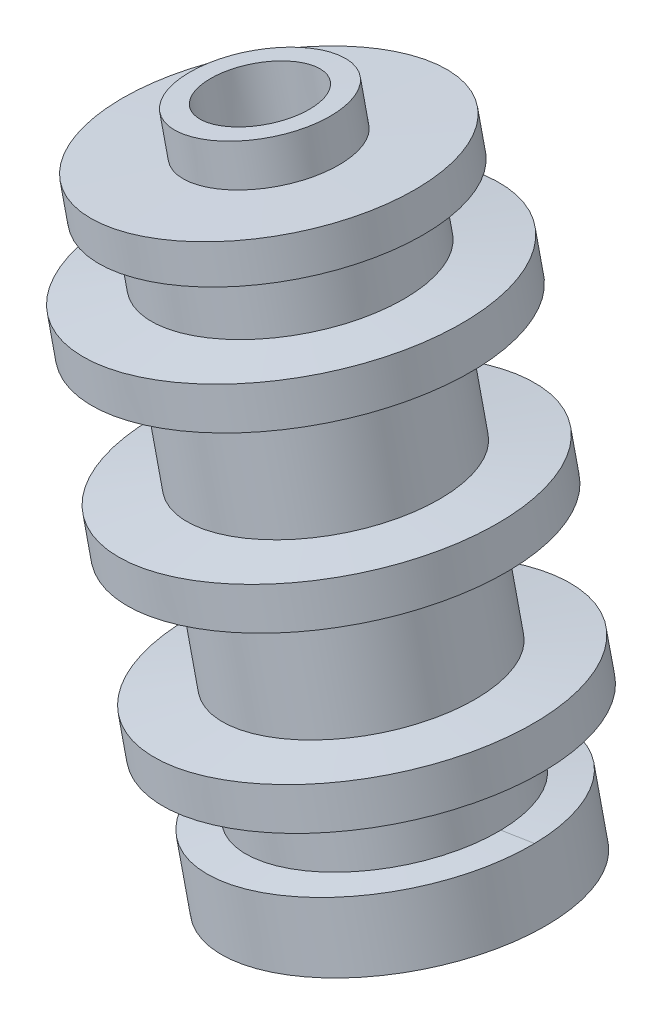
ISO-10303-21;
HEADER;
FILE_DESCRIPTION(('STEP AP214'),'2;1');
FILE_NAME('part.step','',(''),(''),'','','');
FILE_SCHEMA(('AUTOMOTIVE_DESIGN { 1 0 10303 214 1 1 1 1 }'));
ENDSEC;
DATA;
#1=APPLICATION_CONTEXT('core data for automotive mechanical design processes');
#2=APPLICATION_PROTOCOL_DEFINITION('international standard','automotive_design',2000,#1);
#3=PRODUCT_CONTEXT('',#1,'mechanical');
#4=PRODUCT('Part','Part','',(#3));
#5=PRODUCT_RELATED_PRODUCT_CATEGORY('part','',(#4));
#6=PRODUCT_DEFINITION_FORMATION('','',#4);
#7=PRODUCT_DEFINITION_CONTEXT('part definition',#1,'design');
#8=PRODUCT_DEFINITION('design','',#6,#7);
#9=PRODUCT_DEFINITION_SHAPE('','',#8);
#10=(LENGTH_UNIT() NAMED_UNIT(*) SI_UNIT(.MILLI.,.METRE.));
#11=(NAMED_UNIT(*) PLANE_ANGLE_UNIT() SI_UNIT($,.RADIAN.));
#12=(NAMED_UNIT(*) SI_UNIT($,.STERADIAN.) SOLID_ANGLE_UNIT());
#13=UNCERTAINTY_MEASURE_WITH_UNIT(LENGTH_MEASURE(1.E-05),#10,'distance_accuracy_value','');
#14=(GEOMETRIC_REPRESENTATION_CONTEXT(3) GLOBAL_UNCERTAINTY_ASSIGNED_CONTEXT((#13)) GLOBAL_UNIT_ASSIGNED_CONTEXT((#10,
#11,#12)) REPRESENTATION_CONTEXT('',''));
#15=CARTESIAN_POINT('',(0.,0.,0.));
#16=DIRECTION('',(0.,0.,1.));
#17=DIRECTION('',(1.,0.,0.));
#18=AXIS2_PLACEMENT_3D('',#15,#16,#17);
#19=CARTESIAN_POINT('',(-23.4539001258528,-5.09677043690609,0.));
#20=DIRECTION('',(-0.222520933956313,0.974927912181824,0.));
#21=DIRECTION('',(-0.974927912181824,-0.222520933956313,0.));
#22=AXIS2_PLACEMENT_3D('',#19,#20,#21);
#23=CYLINDRICAL_SURFACE('',#22,4.5);
#24=CARTESIAN_POINT('',(-23.2870094253823,-5.82796637105687,0.));
#25=DIRECTION('',(-0.222520933956314,0.974927912181824,0.));
#26=DIRECTION('',(0.974692344569262,0.22246716718597,-0.0219816505823509));
#27=AXIS2_PLACEMENT_3D('',#24,#25,#26);
#28=CIRCLE('',#27,4.50000000003536);
#29=CARTESIAN_POINT('',(-18.9008938747861,-4.82686411871214,-0.0989174276213589));
#30=VERTEX_POINT('',#29);
#31=EDGE_CURVE('E94',#30,#30,#28,.F.);
#32=ORIENTED_EDGE('',*,*,#31,.F.);
#33=EDGE_LOOP('',(#32));
#34=FACE_BOUND('',#33,.T.);
#35=CARTESIAN_POINT('',(-23.5095303593451,-4.85303845884635,0.));
#36=DIRECTION('',(0.222520933956314,-0.974927912181824,0.));
#37=DIRECTION('',(-0.974692344569255,-0.222467167185967,0.0219816505827007));
#38=AXIS2_PLACEMENT_3D('',#35,#36,#37);
#39=CIRCLE('',#38,4.50000000004478);
#40=CARTESIAN_POINT('',(-27.8956459099504,-5.85414071119317,0.0989174276231353));
#41=VERTEX_POINT('',#40);
#42=EDGE_CURVE('E93',#41,#41,#39,.F.);
#43=ORIENTED_EDGE('',*,*,#42,.F.);
#44=EDGE_LOOP('',(#43));
#45=FACE_BOUND('',#44,.T.);
#46=ADVANCED_FACE('F17',(#34,#45),#23,.T.);
#47=CARTESIAN_POINT('',(-23.2870094253812,-5.82796637106157,0.));
#48=DIRECTION('',(-0.222520933956315,0.974927912181824,0.));
#49=DIRECTION('',(-0.974927912181824,-0.222520933956314,0.));
#50=AXIS2_PLACEMENT_3D('',#47,#48,#49);
#51=CONICAL_SURFACE('',#50,4.49999999980098,1.48352986419928);
#52=ORIENTED_EDGE('',*,*,#31,.T.);
#53=EDGE_LOOP('',(#52));
#54=FACE_BOUND('',#53,.T.);
#55=CARTESIAN_POINT('',(-23.257807336708,-5.95590908114882,0.));
#56=DIRECTION('',(-0.222520933956314,0.974927912181824,0.));
#57=DIRECTION('',(-0.974927912181824,-0.222520933956314,0.));
#58=AXIS2_PLACEMENT_3D('',#55,#56,#57);
#59=CIRCLE('',#58,3.);
#60=CARTESIAN_POINT('',(-26.1825910732534,-6.62347188301777,0.));
#61=VERTEX_POINT('',#60);
#62=EDGE_CURVE('E88',#61,#61,#59,.F.);
#63=ORIENTED_EDGE('',*,*,#62,.F.);
#64=EDGE_LOOP('',(#63));
#65=FACE_BOUND('',#64,.T.);
#66=ADVANCED_FACE('F368',(#54,#65),#51,.T.);
#67=CARTESIAN_POINT('',(-23.5095303593462,-4.85303845884165,0.));
#68=DIRECTION('',(0.222520933956314,-0.974927912181824,0.));
#69=DIRECTION('',(0.974927912181824,0.222520933956314,0.));
#70=AXIS2_PLACEMENT_3D('',#67,#68,#69);
#71=CONICAL_SURFACE('',#70,4.4999999998104,1.48352986420687);
#72=CARTESIAN_POINT('',(-23.5387324480194,-4.72509574875428,0.));
#73=DIRECTION('',(-0.222520933956313,0.974927912181824,0.));
#74=DIRECTION('',(-0.974927912181824,-0.222520933956313,0.));
#75=AXIS2_PLACEMENT_3D('',#72,#73,#74);
#76=CIRCLE('',#75,3.);
#77=CARTESIAN_POINT('',(-26.4635161845649,-5.39265855062322,0.));
#78=VERTEX_POINT('',#77);
#79=EDGE_CURVE('E85',#78,#78,#76,.T.);
#80=ORIENTED_EDGE('',*,*,#79,.F.);
#81=EDGE_LOOP('',(#80));
#82=FACE_BOUND('',#81,.T.);
#83=ORIENTED_EDGE('',*,*,#42,.T.);
#84=EDGE_LOOP('',(#83));
#85=FACE_BOUND('',#84,.T.);
#86=ADVANCED_FACE('F359',(#82,#85),#71,.T.);
#87=CARTESIAN_POINT('',(-22.4859340631428,-9.33770685489703,0.));
#88=DIRECTION('',(-0.222520933956314,0.974927912181824,0.));
#89=DIRECTION('',(-0.974927912181824,-0.222520933956314,0.));
#90=AXIS2_PLACEMENT_3D('',#87,#88,#89);
#91=CYLINDRICAL_SURFACE('',#90,3.);
#92=ORIENTED_EDGE('',*,*,#62,.T.);
#93=EDGE_LOOP('',(#92));
#94=FACE_BOUND('',#93,.T.);
#95=CARTESIAN_POINT('',(-22.6263966187943,-8.72230018871812,0.));
#96=DIRECTION('',(0.222520933956314,-0.974927912181824,0.));
#97=DIRECTION('',(-0.974692344569238,-0.222467167185964,0.0219816505834769));
#98=AXIS2_PLACEMENT_3D('',#95,#96,#97);
#99=CIRCLE('',#98,2.99999999989704);
#100=CARTESIAN_POINT('',(-25.5504736524017,-9.3897016902531,0.0659449517481647));
#101=VERTEX_POINT('',#100);
#102=EDGE_CURVE('E82',#101,#101,#99,.T.);
#103=ORIENTED_EDGE('',*,*,#102,.F.);
#104=EDGE_LOOP('',(#103));
#105=FACE_BOUND('',#104,.T.);
#106=ADVANCED_FACE('F350',(#94,#105),#91,.T.);
#107=CARTESIAN_POINT('',(-24.3106057215846,-1.34329797500607,0.));
#108=DIRECTION('',(-0.222520933956313,0.974927912181824,0.));
#109=DIRECTION('',(-0.974927912181824,-0.222520933956313,0.));
#110=AXIS2_PLACEMENT_3D('',#107,#108,#109);
#111=CYLINDRICAL_SURFACE('',#110,3.);
#112=ORIENTED_EDGE('',*,*,#79,.T.);
#113=EDGE_LOOP('',(#112));
#114=FACE_BOUND('',#113,.T.);
#115=CARTESIAN_POINT('',(-24.1701431659336,-1.95870464118275,0.));
#116=DIRECTION('',(-0.222520933956314,0.974927912181824,0.));
#117=DIRECTION('',(0.974692344569255,0.222467167185967,-0.0219816505826857));
#118=AXIS2_PLACEMENT_3D('',#115,#116,#117);
#119=CIRCLE('',#118,3.00000000000479);
#120=CARTESIAN_POINT('',(-21.2460661322211,-1.29130313962378,-0.0659449517481647));
#121=VERTEX_POINT('',#120);
#122=EDGE_CURVE('E79',#121,#121,#119,.T.);
#123=ORIENTED_EDGE('',*,*,#122,.F.);
#124=EDGE_LOOP('',(#123));
#125=FACE_BOUND('',#124,.T.);
#126=ADVANCED_FACE('F341',(#114,#125),#111,.T.);
#127=CARTESIAN_POINT('',(-22.5971945301109,-8.85024289885032,0.));
#128=DIRECTION('',(0.222520933956314,-0.974927912181824,0.));
#129=DIRECTION('',(0.974927912181824,0.222520933956314,0.));
#130=AXIS2_PLACEMENT_3D('',#127,#128,#129);
#131=CONICAL_SURFACE('',#130,4.50000000027079,1.48352986418011);
#132=CARTESIAN_POINT('',(-22.597194530121,-8.85024289880612,0.));
#133=DIRECTION('',(-0.222520933956314,0.974927912181824,0.));
#134=DIRECTION('',(-0.974927912181824,-0.222520933956314,0.));
#135=AXIS2_PLACEMENT_3D('',#132,#133,#134);
#136=CIRCLE('',#135,4.5);
#137=CARTESIAN_POINT('',(-26.9843701349392,-9.85158710160953,0.));
#138=VERTEX_POINT('',#137);
#139=EDGE_CURVE('E76',#138,#138,#136,.F.);
#140=ORIENTED_EDGE('',*,*,#139,.F.);
#141=EDGE_LOOP('',(#140));
#142=FACE_BOUND('',#141,.T.);
#143=ORIENTED_EDGE('',*,*,#102,.T.);
#144=EDGE_LOOP('',(#143));
#145=FACE_BOUND('',#144,.T.);
#146=ADVANCED_FACE('F332',(#142,#145),#131,.T.);
#147=CARTESIAN_POINT('',(-24.1993452546054,-1.83076193110165,0.));
#148=DIRECTION('',(-0.222520933956314,0.974927912181824,0.));
#149=DIRECTION('',(-0.974927912181824,-0.222520933956314,0.));
#150=AXIS2_PLACEMENT_3D('',#147,#148,#149);
#151=CONICAL_SURFACE('',#150,4.49999999984169,1.48352986420807);
#152=ORIENTED_EDGE('',*,*,#122,.T.);
#153=EDGE_LOOP('',(#152));
#154=FACE_BOUND('',#153,.T.);
#155=CARTESIAN_POINT('',(-24.1993452546064,-1.83076193109698,0.));
#156=DIRECTION('',(-0.222520933956313,0.974927912181824,0.));
#157=DIRECTION('',(-0.974927912181824,-0.222520933956313,0.));
#158=AXIS2_PLACEMENT_3D('',#155,#156,#157);
#159=CIRCLE('',#158,4.5);
#160=CARTESIAN_POINT('',(-28.5865208594246,-2.83210613390039,0.));
#161=VERTEX_POINT('',#160);
#162=EDGE_CURVE('E73',#161,#161,#159,.T.);
#163=ORIENTED_EDGE('',*,*,#162,.F.);
#164=EDGE_LOOP('',(#163));
#165=FACE_BOUND('',#164,.T.);
#166=ADVANCED_FACE('F160',(#154,#165),#151,.T.);
#167=CARTESIAN_POINT('',(-22.4859340631428,-9.33770685489703,0.));
#168=DIRECTION('',(-0.222520933956314,0.974927912181824,0.));
#169=DIRECTION('',(-0.974927912181824,-0.222520933956314,0.));
#170=AXIS2_PLACEMENT_3D('',#167,#168,#169);
#171=CYLINDRICAL_SURFACE('',#170,4.5);
#172=ORIENTED_EDGE('',*,*,#139,.T.);
#173=EDGE_LOOP('',(#172));
#174=FACE_BOUND('',#173,.T.);
#175=CARTESIAN_POINT('',(-22.3746735961642,-9.82517081098977,0.));
#176=DIRECTION('',(-0.222520933956314,0.974927912181824,0.));
#177=DIRECTION('',(0.974692344569259,0.222467167185969,-0.0219816505825188));
#178=AXIS2_PLACEMENT_3D('',#175,#176,#177);
#179=CIRCLE('',#178,4.50000000000098);
#180=CARTESIAN_POINT('',(-17.9885580456016,-8.8240685586527,-0.0989174276213589));
#181=VERTEX_POINT('',#180);
#182=EDGE_CURVE('E70',#181,#181,#179,.F.);
#183=ORIENTED_EDGE('',*,*,#182,.F.);
#184=EDGE_LOOP('',(#183));
#185=FACE_BOUND('',#184,.T.);
#186=ADVANCED_FACE('F150',(#174,#185),#171,.T.);
#187=CARTESIAN_POINT('',(-24.3106057215846,-1.34329797500607,0.));
#188=DIRECTION('',(-0.222520933956313,0.974927912181824,0.));
#189=DIRECTION('',(-0.974927912181824,-0.222520933956313,0.));
#190=AXIS2_PLACEMENT_3D('',#187,#188,#189);
#191=CYLINDRICAL_SURFACE('',#190,4.5);
#192=ORIENTED_EDGE('',*,*,#162,.T.);
#193=EDGE_LOOP('',(#192));
#194=FACE_BOUND('',#193,.T.);
#195=CARTESIAN_POINT('',(-24.4218661885603,-0.855834018925778,0.));
#196=DIRECTION('',(0.222520933956314,-0.974927912181824,0.));
#197=DIRECTION('',(-0.974692344569245,-0.222467167185965,0.0219816505831393));
#198=AXIS2_PLACEMENT_3D('',#195,#196,#197);
#199=CIRCLE('',#198,4.499999999955);
#200=CARTESIAN_POINT('',(-28.8079817390781,-1.85693627125261,0.0989174276231353));
#201=VERTEX_POINT('',#200);
#202=EDGE_CURVE('E66',#201,#201,#199,.F.);
#203=ORIENTED_EDGE('',*,*,#202,.F.);
#204=EDGE_LOOP('',(#203));
#205=FACE_BOUND('',#204,.T.);
#206=ADVANCED_FACE('F148',(#194,#205),#191,.T.);
#207=CARTESIAN_POINT('',(-22.3746735961715,-9.82517081095806,0.));
#208=DIRECTION('',(-0.222520933956314,0.974927912181824,0.));
#209=DIRECTION('',(-0.974927912181824,-0.222520933956314,0.));
#210=AXIS2_PLACEMENT_3D('',#207,#208,#209);
#211=CONICAL_SURFACE('',#210,4.50000000024168,1.4835298641941);
#212=ORIENTED_EDGE('',*,*,#182,.T.);
#213=EDGE_LOOP('',(#212));
#214=FACE_BOUND('',#213,.T.);
#215=CARTESIAN_POINT('',(-22.3454715074871,-9.95311352109431,0.));
#216=DIRECTION('',(-0.222520933956314,0.974927912181824,0.));
#217=DIRECTION('',(-0.974927912181824,-0.222520933956314,0.));
#218=AXIS2_PLACEMENT_3D('',#215,#216,#217);
#219=CIRCLE('',#218,3.);
#220=CARTESIAN_POINT('',(-25.2702552440326,-10.6206763229632,0.));
#221=VERTEX_POINT('',#220);
#222=EDGE_CURVE('E69',#221,#221,#219,.F.);
#223=ORIENTED_EDGE('',*,*,#222,.F.);
#224=EDGE_LOOP('',(#223));
#225=FACE_BOUND('',#224,.T.);
#226=ADVANCED_FACE('F144',(#214,#225),#211,.T.);
#227=CARTESIAN_POINT('',(-24.4218661885525,-0.855834018959846,0.));
#228=DIRECTION('',(0.222520933956314,-0.974927912181824,0.));
#229=DIRECTION('',(0.974927912181824,0.222520933956314,0.));
#230=AXIS2_PLACEMENT_3D('',#227,#228,#229);
#231=CONICAL_SURFACE('',#230,4.50000000031287,1.48352986419928);
#232=CARTESIAN_POINT('',(-24.4510682772403,-0.727891308808795,0.));
#233=DIRECTION('',(-0.222520933956313,0.974927912181824,0.));
#234=DIRECTION('',(-0.974927912181824,-0.222520933956313,0.));
#235=AXIS2_PLACEMENT_3D('',#232,#233,#234);
#236=CIRCLE('',#235,3.);
#237=CARTESIAN_POINT('',(-27.3758520137858,-1.39545411067774,0.));
#238=VERTEX_POINT('',#237);
#239=EDGE_CURVE('E52',#238,#238,#236,.T.);
#240=ORIENTED_EDGE('',*,*,#239,.F.);
#241=EDGE_LOOP('',(#240));
#242=FACE_BOUND('',#241,.T.);
#243=ORIENTED_EDGE('',*,*,#202,.T.);
#244=EDGE_LOOP('',(#243));
#245=FACE_BOUND('',#244,.T.);
#246=ADVANCED_FACE('F141',(#242,#245),#231,.T.);
#247=CARTESIAN_POINT('',(-22.4859340631428,-9.33770685489703,0.));
#248=DIRECTION('',(-0.222520933956314,0.974927912181824,0.));
#249=DIRECTION('',(-0.974927912181824,-0.222520933956314,0.));
#250=AXIS2_PLACEMENT_3D('',#247,#248,#249);
#251=CYLINDRICAL_SURFACE('',#250,3.);
#252=ORIENTED_EDGE('',*,*,#222,.T.);
#253=EDGE_LOOP('',(#252));
#254=FACE_BOUND('',#253,.T.);
#255=CARTESIAN_POINT('',(-22.0240619053832,-11.3613009970459,0.));
#256=DIRECTION('',(0.222520933956314,-0.974927912181824,0.));
#257=DIRECTION('',(-0.974692344569272,-0.222467167185972,0.0219816505818862));
#258=AXIS2_PLACEMENT_3D('',#255,#256,#257);
#259=CIRCLE('',#258,3.00000000003333);
#260=CARTESIAN_POINT('',(-24.9481389391165,-12.0287024986044,0.0659449517467177));
#261=VERTEX_POINT('',#260);
#262=CARTESIAN_POINT('',(-19.099984871546,-10.6938994954557,-0.065944951750521));
#263=VERTEX_POINT('',#262);
#264=EDGE_CURVE('E42',#261,#263,#259,.T.);
#265=ORIENTED_EDGE('',*,*,#264,.F.);
#266=CARTESIAN_POINT('',(-22.0240619053832,-11.3613009970459,0.));
#267=DIRECTION('',(0.222520933956314,-0.974927912181824,0.));
#268=DIRECTION('',(-0.974692344569272,-0.222467167185972,0.0219816505818862));
#269=AXIS2_PLACEMENT_3D('',#266,#267,#268);
#270=CIRCLE('',#269,3.00000000003333);
#271=EDGE_CURVE('E47',#263,#261,#270,.T.);
#272=ORIENTED_EDGE('',*,*,#271,.F.);
#273=EDGE_LOOP('',(#265,#272));
#274=FACE_BOUND('',#273,.T.);
#275=ADVANCED_FACE('F58',(#254,#274),#251,.T.);
#276=CARTESIAN_POINT('',(-24.3106057215846,-1.34329797500607,0.));
#277=DIRECTION('',(-0.222520933956313,0.974927912181824,0.));
#278=DIRECTION('',(-0.974927912181824,-0.222520933956313,0.));
#279=AXIS2_PLACEMENT_3D('',#276,#277,#278);
#280=CYLINDRICAL_SURFACE('',#279,3.);
#281=ORIENTED_EDGE('',*,*,#239,.T.);
#282=EDGE_LOOP('',(#281));
#283=FACE_BOUND('',#282,.T.);
#284=CARTESIAN_POINT('',(-24.7724778793442,0.680296167142665,0.));
#285=DIRECTION('',(-0.222520933956314,0.974927912181824,0.));
#286=DIRECTION('',(0.974692344569258,0.222467167185968,-0.0219816505825451));
#287=AXIS2_PLACEMENT_3D('',#284,#285,#286);
#288=CIRCLE('',#287,3.00000000002399);
#289=CARTESIAN_POINT('',(-21.848400845613,1.34769766870591,-0.0659449517481647));
#290=VERTEX_POINT('',#289);
#291=EDGE_CURVE('E56',#290,#290,#288,.T.);
#292=ORIENTED_EDGE('',*,*,#291,.F.);
#293=EDGE_LOOP('',(#292));
#294=FACE_BOUND('',#293,.T.);
#295=ADVANCED_FACE('F138',(#283,#294),#280,.T.);
#296=CARTESIAN_POINT('',(-22.0075140551307,-11.4338018661145,0.));
#297=DIRECTION('',(0.222520933956315,-0.974927912181824,0.));
#298=DIRECTION('',(0.974927912181824,0.222520933956315,0.));
#299=AXIS2_PLACEMENT_3D('',#296,#297,#298);
#300=CONICAL_SURFACE('',#299,3.85000000019705,1.48352986420196);
#301=DIRECTION('',(0.951589368653993,0.306591178763796,-0.0218980037656571));
#302=VECTOR('',#301,1.);
#303=CARTESIAN_POINT('',(-499000.,-160776.066598591,11482.4951571212));
#304=LINE('',#303,#302);
#305=CARTESIAN_POINT('',(-25.7600795817322,-12.2903004597573,0.0846293547426299));
#306=VERTEX_POINT('',#305);
#307=EDGE_CURVE('E50',#306,#261,#304,.T.);
#308=ORIENTED_EDGE('',*,*,#307,.F.);
#309=CARTESIAN_POINT('',(-22.0075140551367,-11.433801866088,0.));
#310=DIRECTION('',(-0.222520933956314,0.974927912181824,0.));
#311=DIRECTION('',(-0.974927912181824,-0.222520933956314,0.));
#312=AXIS2_PLACEMENT_3D('',#309,#310,#311);
#313=CIRCLE('',#312,3.85);
#314=CARTESIAN_POINT('',(-18.2549485284967,-10.5773032724126,-0.0846293547444099));
#315=VERTEX_POINT('',#314);
#316=EDGE_CURVE('E124',#315,#306,#313,.F.);
#317=ORIENTED_EDGE('',*,*,#316,.F.);
#318=DIRECTION('',(-0.990377323206647,-0.136650046136422,0.021898003766338));
#319=VECTOR('',#318,1.);
#320=CARTESIAN_POINT('',(519294.789479925,71643.0741056935,-11482.4951574782));
#321=LINE('',#320,#319);
#322=EDGE_CURVE('E35',#263,#315,#321,.F.);
#323=ORIENTED_EDGE('',*,*,#322,.F.);
#324=ORIENTED_EDGE('',*,*,#271,.T.);
#325=EDGE_LOOP('',(#308,#317,#323,#324));
#326=FACE_BOUND('',#325,.T.);
#327=ADVANCED_FACE('F48',(#326),#300,.T.);
#328=CARTESIAN_POINT('',(-22.007514055134,-11.4338018660998,0.));
#329=DIRECTION('',(0.222520933956314,-0.974927912181824,0.));
#330=DIRECTION('',(0.974927912181824,0.222520933956314,0.));
#331=AXIS2_PLACEMENT_3D('',#328,#329,#330);
#332=CONICAL_SURFACE('',#331,3.85000000013524,1.48352986421323);
#333=CARTESIAN_POINT('',(-22.0075140551367,-11.433801866088,0.));
#334=DIRECTION('',(-0.222520933956314,0.974927912181824,0.));
#335=DIRECTION('',(-0.974927912181824,-0.222520933956314,0.));
#336=AXIS2_PLACEMENT_3D('',#333,#334,#335);
#337=CIRCLE('',#336,3.85);
#338=EDGE_CURVE('E55',#306,#315,#337,.F.);
#339=ORIENTED_EDGE('',*,*,#338,.F.);
#340=ORIENTED_EDGE('',*,*,#307,.T.);
#341=ORIENTED_EDGE('',*,*,#264,.T.);
#342=ORIENTED_EDGE('',*,*,#322,.T.);
#343=EDGE_LOOP('',(#339,#340,#341,#342));
#344=FACE_BOUND('',#343,.T.);
#345=ADVANCED_FACE('F54',(#344),#332,.T.);
#346=CARTESIAN_POINT('',(-24.7890257295917,0.7527970361895,0.));
#347=DIRECTION('',(-0.222520933956313,0.974927912181824,0.));
#348=DIRECTION('',(-0.974927912181824,-0.222520933956313,0.));
#349=AXIS2_PLACEMENT_3D('',#346,#347,#348);
#350=CONICAL_SURFACE('',#349,3.84999999977432,1.48352986418152);
#351=ORIENTED_EDGE('',*,*,#291,.T.);
#352=EDGE_LOOP('',(#351));
#353=FACE_BOUND('',#352,.T.);
#354=CARTESIAN_POINT('',(-24.7890257295907,0.752797036184849,0.));
#355=DIRECTION('',(-0.222520933956313,0.974927912181824,0.));
#356=DIRECTION('',(-0.974927912181824,-0.222520933956313,0.));
#357=AXIS2_PLACEMENT_3D('',#354,#355,#356);
#358=CIRCLE('',#357,3.85);
#359=CARTESIAN_POINT('',(-28.5424981914907,-0.103908559546957,0.));
#360=VERTEX_POINT('',#359);
#361=EDGE_CURVE('E117',#360,#360,#358,.T.);
#362=ORIENTED_EDGE('',*,*,#361,.F.);
#363=EDGE_LOOP('',(#362));
#364=FACE_BOUND('',#363,.T.);
#365=ADVANCED_FACE('F202',(#353,#364),#350,.T.);
#366=CARTESIAN_POINT('',(-21.8100242036477,-12.2990614403943,0.));
#367=DIRECTION('',(-0.222520933956314,0.974927912181824,0.));
#368=DIRECTION('',(-0.974927912181824,-0.222520933956314,0.));
#369=AXIS2_PLACEMENT_3D('',#366,#367,#368);
#370=CYLINDRICAL_SURFACE('',#369,3.85);
#371=ORIENTED_EDGE('',*,*,#316,.T.);
#372=ORIENTED_EDGE('',*,*,#338,.T.);
#373=EDGE_LOOP('',(#371,#372));
#374=FACE_BOUND('',#373,.T.);
#375=CARTESIAN_POINT('',(-21.6403545141088,-13.042432921188,0.));
#376=DIRECTION('',(-0.222520933956314,0.974927912181824,0.));
#377=DIRECTION('',(-0.974927912181824,-0.222520933956314,0.));
#378=AXIS2_PLACEMENT_3D('',#375,#376,#377);
#379=CIRCLE('',#378,3.85);
#380=CARTESIAN_POINT('',(-25.3938269760088,-13.8991385169198,0.));
#381=VERTEX_POINT('',#380);
#382=EDGE_CURVE('E20',#381,#381,#379,.T.);
#383=ORIENTED_EDGE('',*,*,#382,.T.);
#384=EDGE_LOOP('',(#383));
#385=FACE_BOUND('',#384,.T.);
#386=ADVANCED_FACE('F198',(#374,#385),#370,.T.);
#387=CARTESIAN_POINT('',(-24.9865155810797,1.61805661049122,0.));
#388=DIRECTION('',(-0.222520933956313,0.974927912181824,0.));
#389=DIRECTION('',(-0.974927912181824,-0.222520933956313,0.));
#390=AXIS2_PLACEMENT_3D('',#387,#388,#389);
#391=CYLINDRICAL_SURFACE('',#390,3.85);
#392=ORIENTED_EDGE('',*,*,#361,.T.);
#393=EDGE_LOOP('',(#392));
#394=FACE_BOUND('',#393,.T.);
#395=CARTESIAN_POINT('',(-24.9954687443832,1.65728298192383,0.));
#396=DIRECTION('',(0.222520933956314,-0.974927912181824,0.));
#397=DIRECTION('',(-0.974692344569242,-0.222467167185965,0.0219816505833002));
#398=AXIS2_PLACEMENT_3D('',#395,#396,#397);
#399=CIRCLE('',#398,3.84999999998628);
#400=CARTESIAN_POINT('',(-28.7480342709614,0.800784388260922,0.0846293547454025));
#401=VERTEX_POINT('',#400);
#402=EDGE_CURVE('E107',#401,#401,#399,.F.);
#403=ORIENTED_EDGE('',*,*,#402,.F.);
#404=EDGE_LOOP('',(#403));
#405=FACE_BOUND('',#404,.T.);
#406=ADVANCED_FACE('F194',(#394,#405),#391,.T.);
#407=CARTESIAN_POINT('',(-18.8624813320864,-12.4084014947079,-0.0626477041603265));
#408=DIRECTION('',(-0.222520933956314,0.974927912181824,0.));
#409=DIRECTION('',(-0.974927912181824,-0.222520933956314,0.));
#410=AXIS2_PLACEMENT_3D('',#407,#408,#409);
#411=PLANE('',#410);
#412=ORIENTED_EDGE('',*,*,#382,.F.);
#413=EDGE_LOOP('',(#412));
#414=FACE_BOUND('',#413,.T.);
#415=CARTESIAN_POINT('',(-21.6403545141088,-13.042432921188,0.));
#416=DIRECTION('',(-0.222520933956314,0.974927912181824,0.));
#417=DIRECTION('',(-0.974927912181824,-0.222520933956314,0.));
#418=AXIS2_PLACEMENT_3D('',#415,#416,#417);
#419=CIRCLE('',#418,2.85);
#420=CARTESIAN_POINT('',(-24.418899063827,-13.6766175829635,0.));
#421=VERTEX_POINT('',#420);
#422=EDGE_CURVE('E105',#421,#421,#419,.F.);
#423=ORIENTED_EDGE('',*,*,#422,.F.);
#424=EDGE_LOOP('',(#423));
#425=FACE_BOUND('',#424,.T.);
#426=ADVANCED_FACE('F190',(#414,#425),#411,.F.);
#427=CARTESIAN_POINT('',(-24.9954687443824,1.65728298192029,0.));
#428=DIRECTION('',(0.222520933956314,-0.974927912181824,0.));
#429=DIRECTION('',(0.974927912181824,0.222520933956314,0.));
#430=AXIS2_PLACEMENT_3D('',#427,#428,#429);
#431=CONICAL_SURFACE('',#430,3.85000000150339,1.56206968053643);
#432=CARTESIAN_POINT('',(-24.9993525659249,1.67429911591026,0.));
#433=DIRECTION('',(-0.222520933956314,0.974927912181824,0.));
#434=DIRECTION('',(-0.974927912181824,-0.222520933956314,0.));
#435=AXIS2_PLACEMENT_3D('',#432,#433,#434);
#436=CIRCLE('',#435,1.85);
#437=CARTESIAN_POINT('',(-26.8029692034613,1.26263538809108,0.));
#438=VERTEX_POINT('',#437);
#439=EDGE_CURVE('E104',#438,#438,#436,.T.);
#440=ORIENTED_EDGE('',*,*,#439,.F.);
#441=EDGE_LOOP('',(#440));
#442=FACE_BOUND('',#441,.T.);
#443=ORIENTED_EDGE('',*,*,#402,.T.);
#444=EDGE_LOOP('',(#443));
#445=FACE_BOUND('',#444,.T.);
#446=ADVANCED_FACE('F187',(#442,#445),#431,.T.);
#447=CARTESIAN_POINT('',(-21.6167104035746,-13.1460245379798,0.));
#448=DIRECTION('',(-0.222520933956314,0.974927912181824,0.));
#449=DIRECTION('',(-0.974927912181824,-0.222520933956314,0.));
#450=AXIS2_PLACEMENT_3D('',#447,#448,#449);
#451=CYLINDRICAL_SURFACE('',#450,2.85);
#452=ORIENTED_EDGE('',*,*,#422,.T.);
#453=EDGE_LOOP('',(#452));
#454=FACE_BOUND('',#453,.T.);
#455=CARTESIAN_POINT('',(-21.5735982339219,-13.3349112948425,0.));
#456=DIRECTION('',(-0.222520933956314,0.974927912181824,0.));
#457=DIRECTION('',(-0.974927912181824,-0.222520933956314,0.));
#458=AXIS2_PLACEMENT_3D('',#455,#456,#457);
#459=CIRCLE('',#458,2.85);
#460=CARTESIAN_POINT('',(-24.3521427836401,-13.969095956618,0.));
#461=VERTEX_POINT('',#460);
#462=EDGE_CURVE('E102',#461,#461,#459,.T.);
#463=ORIENTED_EDGE('',*,*,#462,.T.);
#464=EDGE_LOOP('',(#463));
#465=FACE_BOUND('',#464,.T.);
#466=ADVANCED_FACE('F183',(#454,#465),#451,.T.);
#467=CARTESIAN_POINT('',(-25.1106130329031,2.16176307200117,0.));
#468=DIRECTION('',(-0.222520933956314,0.974927912181824,0.));
#469=DIRECTION('',(-0.974927912181824,-0.222520933956314,0.));
#470=AXIS2_PLACEMENT_3D('',#467,#468,#469);
#471=CYLINDRICAL_SURFACE('',#470,1.85);
#472=CARTESIAN_POINT('',(-25.221873499882,2.64922702809547,0.));
#473=DIRECTION('',(0.222520933956314,-0.974927912181824,0.));
#474=DIRECTION('',(-0.0214305247088672,-0.00489137741755595,-0.999758374327348));
#475=AXIS2_PLACEMENT_3D('',#472,#473,#474);
#476=CIRCLE('',#475,1.84999999999063);
#477=CARTESIAN_POINT('',(-25.2615199705932,2.64017797987304,-1.84955299249623));
#478=VERTEX_POINT('',#477);
#479=EDGE_CURVE('E101',#478,#478,#476,.F.);
#480=ORIENTED_EDGE('',*,*,#479,.F.);
#481=EDGE_LOOP('',(#480));
#482=FACE_BOUND('',#481,.T.);
#483=ORIENTED_EDGE('',*,*,#439,.T.);
#484=EDGE_LOOP('',(#483));
#485=FACE_BOUND('',#484,.T.);
#486=ADVANCED_FACE('F179',(#482,#485),#471,.T.);
#487=CARTESIAN_POINT('',(-20.3064981859819,-13.0457039775007,-0.0285761457573436));
#488=DIRECTION('',(-0.222520933956314,0.974927912181824,0.));
#489=DIRECTION('',(-0.974927912181824,-0.222520933956314,0.));
#490=AXIS2_PLACEMENT_3D('',#487,#488,#489);
#491=PLANE('',#490);
#492=ORIENTED_EDGE('',*,*,#462,.F.);
#493=EDGE_LOOP('',(#492));
#494=FACE_BOUND('',#493,.T.);
#495=CARTESIAN_POINT('',(-21.5735982339049,-13.334911294917,0.));
#496=DIRECTION('',(0.222520933956246,-0.974927912181839,0.));
#497=DIRECTION('',(0.974927912181839,0.222520933956246,0.));
#498=AXIS2_PLACEMENT_3D('',#495,#496,#497);
#499=CIRCLE('',#498,1.357247031988);
#500=CARTESIAN_POINT('',(-20.2503802186939,-13.0328954177497,0.));
#501=VERTEX_POINT('',#500);
#502=EDGE_CURVE('E26',#501,#501,#499,.F.);
#503=ORIENTED_EDGE('',*,*,#502,.T.);
#504=EDGE_LOOP('',(#503));
#505=FACE_BOUND('',#504,.T.);
#506=ADVANCED_FACE('F171',(#494,#505),#491,.F.);
#507=CARTESIAN_POINT('',(-25.2218734998817,2.64922702809409,0.));
#508=DIRECTION('',(0.222520933956314,-0.974927912181824,0.));
#509=DIRECTION('',(0.974927912181824,0.222520933956314,0.));
#510=AXIS2_PLACEMENT_3D('',#507,#508,#509);
#511=CONICAL_SURFACE('',#510,1.85000000021808,1.5620696805419);
#512=ORIENTED_EDGE('',*,*,#479,.T.);
#513=EDGE_LOOP('',(#512));
#514=FACE_BOUND('',#513,.T.);
#515=CARTESIAN_POINT('',(-25.2229415507981,2.65390646490699,0.));
#516=DIRECTION('',(0.222520933956313,-0.974927912181824,0.));
#517=DIRECTION('',(-0.974692344569278,-0.222467167185897,0.0219816505824035));
#518=AXIS2_PLACEMENT_3D('',#515,#516,#517);
#519=CIRCLE('',#518,1.30000000001048);
#520=CARTESIAN_POINT('',(-26.4900415987483,2.36469914756299,0.028576145757353));
#521=VERTEX_POINT('',#520);
#522=EDGE_CURVE('E11',#521,#521,#519,.T.);
#523=ORIENTED_EDGE('',*,*,#522,.T.);
#524=EDGE_LOOP('',(#523));
#525=FACE_BOUND('',#524,.T.);
#526=ADVANCED_FACE('F165',(#514,#525),#511,.T.);
#527=CARTESIAN_POINT('',(-21.5735982339359,-13.3349112947815,0.));
#528=DIRECTION('',(0.222520933956246,-0.974927912181839,0.));
#529=DIRECTION('',(0.974927912181839,0.222520933956246,0.));
#530=AXIS2_PLACEMENT_3D('',#527,#528,#529);
#531=CONICAL_SURFACE('',#530,1.35724703198752,0.00349065850428606);
#532=ORIENTED_EDGE('',*,*,#522,.F.);
#533=EDGE_LOOP('',(#532));
#534=FACE_BOUND('',#533,.T.);
#535=ORIENTED_EDGE('',*,*,#502,.F.);
#536=EDGE_LOOP('',(#535));
#537=FACE_BOUND('',#536,.T.);
#538=ADVANCED_FACE('F163',(#534,#537),#531,.F.);
#539=CLOSED_SHELL('',(#46,#66,#86,#106,#126,#146,#166,#186,#206,#226,#246,#275,#295,#327,#345,
#365,#386,#406,#426,#446,#466,#486,#506,#526,#538));
#540=MANIFOLD_SOLID_BREP('B1',#539);
#541=ADVANCED_BREP_SHAPE_REPRESENTATION('',(#18,#540),#14);
#542=SHAPE_DEFINITION_REPRESENTATION(#9,#541);
ENDSEC;
END-ISO-10303-21;
